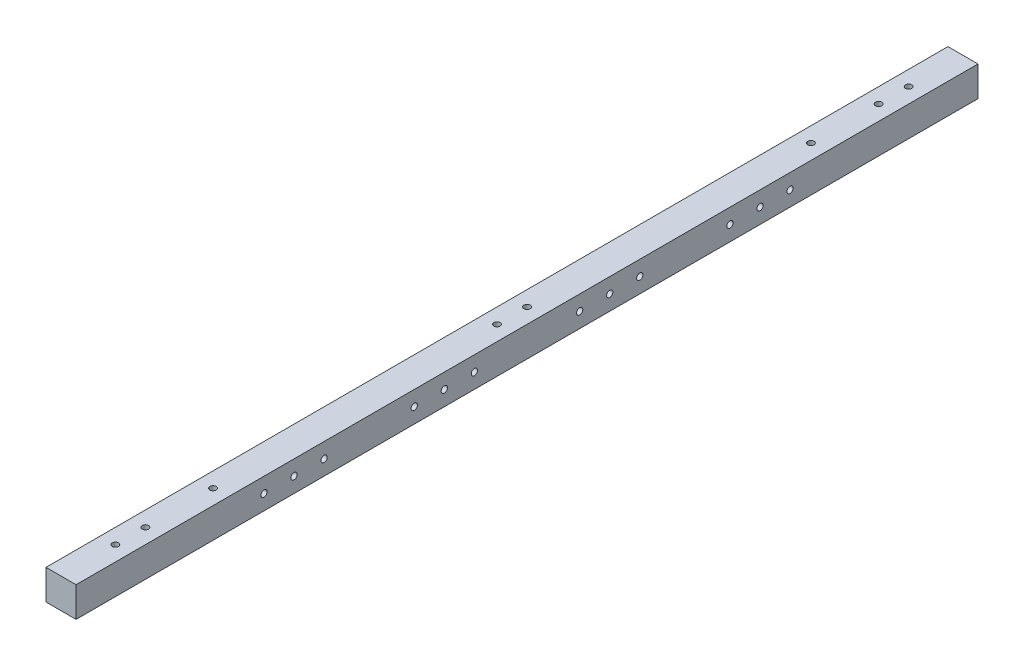
ISO-10303-21;
HEADER;
FILE_DESCRIPTION(('STEP AP214'),'2;1');
FILE_NAME('part.step','',(''),(''),'','','');
FILE_SCHEMA(('AUTOMOTIVE_DESIGN { 1 0 10303 214 1 1 1 1 }'));
ENDSEC;
DATA;
#1=APPLICATION_CONTEXT('core data for automotive mechanical design processes');
#2=APPLICATION_PROTOCOL_DEFINITION('international standard','automotive_design',2000,#1);
#3=PRODUCT_CONTEXT('',#1,'mechanical');
#4=PRODUCT('Part','Part','',(#3));
#5=PRODUCT_RELATED_PRODUCT_CATEGORY('part','',(#4));
#6=PRODUCT_DEFINITION_FORMATION('','',#4);
#7=PRODUCT_DEFINITION_CONTEXT('part definition',#1,'design');
#8=PRODUCT_DEFINITION('design','',#6,#7);
#9=PRODUCT_DEFINITION_SHAPE('','',#8);
#10=(LENGTH_UNIT() NAMED_UNIT(*) SI_UNIT(.MILLI.,.METRE.));
#11=(NAMED_UNIT(*) PLANE_ANGLE_UNIT() SI_UNIT($,.RADIAN.));
#12=(NAMED_UNIT(*) SI_UNIT($,.STERADIAN.) SOLID_ANGLE_UNIT());
#13=UNCERTAINTY_MEASURE_WITH_UNIT(LENGTH_MEASURE(1.E-05),#10,'distance_accuracy_value','');
#14=(GEOMETRIC_REPRESENTATION_CONTEXT(3) GLOBAL_UNCERTAINTY_ASSIGNED_CONTEXT((#13)) GLOBAL_UNIT_ASSIGNED_CONTEXT((#10,
#11,#12)) REPRESENTATION_CONTEXT('',''));
#15=CARTESIAN_POINT('',(0.,0.,0.));
#16=DIRECTION('',(0.,0.,1.));
#17=DIRECTION('',(1.,0.,0.));
#18=AXIS2_PLACEMENT_3D('',#15,#16,#17);
#19=CARTESIAN_POINT('',(10.,10.,600.));
#20=DIRECTION('',(-1.,0.,0.));
#21=DIRECTION('',(0.,0.,1.));
#22=AXIS2_PLACEMENT_3D('',#19,#20,#21);
#23=PLANE('',#22);
#24=CARTESIAN_POINT('',(10.,0.,165.));
#25=DIRECTION('',(-1.,0.,0.));
#26=DIRECTION('',(0.,0.,-1.));
#27=AXIS2_PLACEMENT_3D('',#24,#25,#26);
#28=CIRCLE('',#27,2.09999999999999);
#29=CARTESIAN_POINT('',(10.,0.,162.9));
#30=VERTEX_POINT('',#29);
#31=EDGE_CURVE('E195',#30,#30,#28,.T.);
#32=ORIENTED_EDGE('',*,*,#31,.T.);
#33=EDGE_LOOP('',(#32));
#34=FACE_BOUND('',#33,.T.);
#35=CARTESIAN_POINT('',(10.,0.,145.));
#36=DIRECTION('',(-1.,0.,0.));
#37=DIRECTION('',(0.,0.,-1.));
#38=AXIS2_PLACEMENT_3D('',#35,#36,#37);
#39=CIRCLE('',#38,2.09999999999999);
#40=CARTESIAN_POINT('',(10.,0.,142.9));
#41=VERTEX_POINT('',#40);
#42=EDGE_CURVE('E204',#41,#41,#39,.T.);
#43=ORIENTED_EDGE('',*,*,#42,.T.);
#44=EDGE_LOOP('',(#43));
#45=FACE_BOUND('',#44,.T.);
#46=CARTESIAN_POINT('',(10.,0.,125.));
#47=DIRECTION('',(-1.,0.,0.));
#48=DIRECTION('',(0.,0.,-1.));
#49=AXIS2_PLACEMENT_3D('',#46,#47,#48);
#50=CIRCLE('',#49,2.09999999999999);
#51=CARTESIAN_POINT('',(10.,0.,122.9));
#52=VERTEX_POINT('',#51);
#53=EDGE_CURVE('E212',#52,#52,#50,.T.);
#54=ORIENTED_EDGE('',*,*,#53,.T.);
#55=EDGE_LOOP('',(#54));
#56=FACE_BOUND('',#55,.T.);
#57=CARTESIAN_POINT('',(10.,0.,355.));
#58=DIRECTION('',(-1.,0.,0.));
#59=DIRECTION('',(0.,0.,-1.));
#60=AXIS2_PLACEMENT_3D('',#57,#58,#59);
#61=CIRCLE('',#60,2.09999999999994);
#62=CARTESIAN_POINT('',(10.,0.,352.9));
#63=VERTEX_POINT('',#62);
#64=EDGE_CURVE('E237',#63,#63,#61,.T.);
#65=ORIENTED_EDGE('',*,*,#64,.T.);
#66=EDGE_LOOP('',(#65));
#67=FACE_BOUND('',#66,.T.);
#68=CARTESIAN_POINT('',(10.,0.,265.));
#69=DIRECTION('',(-1.,0.,0.));
#70=DIRECTION('',(0.,0.,1.));
#71=AXIS2_PLACEMENT_3D('',#68,#69,#70);
#72=CIRCLE('',#71,2.09999999999999);
#73=CARTESIAN_POINT('',(10.,0.,267.1));
#74=VERTEX_POINT('',#73);
#75=EDGE_CURVE('E222',#74,#74,#72,.T.);
#76=ORIENTED_EDGE('',*,*,#75,.T.);
#77=EDGE_LOOP('',(#76));
#78=FACE_BOUND('',#77,.T.);
#79=CARTESIAN_POINT('',(10.,0.,245.));
#80=DIRECTION('',(-1.,0.,0.));
#81=DIRECTION('',(0.,0.,1.));
#82=AXIS2_PLACEMENT_3D('',#79,#80,#81);
#83=CIRCLE('',#82,2.09999999999999);
#84=CARTESIAN_POINT('',(10.,0.,247.1));
#85=VERTEX_POINT('',#84);
#86=EDGE_CURVE('E221',#85,#85,#83,.T.);
#87=ORIENTED_EDGE('',*,*,#86,.T.);
#88=EDGE_LOOP('',(#87));
#89=FACE_BOUND('',#88,.T.);
#90=CARTESIAN_POINT('',(10.,0.,375.));
#91=DIRECTION('',(-1.,0.,0.));
#92=DIRECTION('',(0.,0.,-1.));
#93=AXIS2_PLACEMENT_3D('',#90,#91,#92);
#94=CIRCLE('',#93,2.09999999999999);
#95=CARTESIAN_POINT('',(10.,0.,372.9));
#96=VERTEX_POINT('',#95);
#97=EDGE_CURVE('E187',#96,#96,#94,.T.);
#98=ORIENTED_EDGE('',*,*,#97,.T.);
#99=EDGE_LOOP('',(#98));
#100=FACE_BOUND('',#99,.T.);
#101=CARTESIAN_POINT('',(10.,0.,335.));
#102=DIRECTION('',(-1.,0.,0.));
#103=DIRECTION('',(0.,0.,-1.));
#104=AXIS2_PLACEMENT_3D('',#101,#102,#103);
#105=CIRCLE('',#104,2.09999999999999);
#106=CARTESIAN_POINT('',(10.,0.,332.9));
#107=VERTEX_POINT('',#106);
#108=EDGE_CURVE('E238',#107,#107,#105,.T.);
#109=ORIENTED_EDGE('',*,*,#108,.T.);
#110=EDGE_LOOP('',(#109));
#111=FACE_BOUND('',#110,.T.);
#112=CARTESIAN_POINT('',(10.,0.,435.));
#113=DIRECTION('',(-1.,0.,0.));
#114=DIRECTION('',(0.,0.,1.));
#115=AXIS2_PLACEMENT_3D('',#112,#113,#114);
#116=CIRCLE('',#115,2.09999999999999);
#117=CARTESIAN_POINT('',(10.,0.,437.1));
#118=VERTEX_POINT('',#117);
#119=EDGE_CURVE('E268',#118,#118,#116,.T.);
#120=ORIENTED_EDGE('',*,*,#119,.T.);
#121=EDGE_LOOP('',(#120));
#122=FACE_BOUND('',#121,.T.);
#123=CARTESIAN_POINT('',(10.,0.,455.));
#124=DIRECTION('',(-1.,0.,0.));
#125=DIRECTION('',(0.,0.,1.));
#126=AXIS2_PLACEMENT_3D('',#123,#124,#125);
#127=CIRCLE('',#126,2.09999999999999);
#128=CARTESIAN_POINT('',(10.,0.,457.1));
#129=VERTEX_POINT('',#128);
#130=EDGE_CURVE('E260',#129,#129,#127,.T.);
#131=ORIENTED_EDGE('',*,*,#130,.T.);
#132=EDGE_LOOP('',(#131));
#133=FACE_BOUND('',#132,.T.);
#134=CARTESIAN_POINT('',(10.,0.,475.));
#135=DIRECTION('',(-1.,0.,0.));
#136=DIRECTION('',(0.,0.,1.));
#137=AXIS2_PLACEMENT_3D('',#134,#135,#136);
#138=CIRCLE('',#137,2.09999999999999);
#139=CARTESIAN_POINT('',(10.,0.,477.1));
#140=VERTEX_POINT('',#139);
#141=EDGE_CURVE('E252',#140,#140,#138,.T.);
#142=ORIENTED_EDGE('',*,*,#141,.T.);
#143=EDGE_LOOP('',(#142));
#144=FACE_BOUND('',#143,.T.);
#145=CARTESIAN_POINT('',(10.,0.,225.));
#146=DIRECTION('',(-1.,0.,0.));
#147=DIRECTION('',(0.,0.,1.));
#148=AXIS2_PLACEMENT_3D('',#145,#146,#147);
#149=CIRCLE('',#148,2.09999999999999);
#150=CARTESIAN_POINT('',(10.,0.,227.1));
#151=VERTEX_POINT('',#150);
#152=EDGE_CURVE('E176',#151,#151,#149,.T.);
#153=ORIENTED_EDGE('',*,*,#152,.T.);
#154=EDGE_LOOP('',(#153));
#155=FACE_BOUND('',#154,.T.);
#156=DIRECTION('',(0.,1.,0.));
#157=VECTOR('',#156,1.);
#158=CARTESIAN_POINT('',(10.,10.,0.));
#159=LINE('',#158,#157);
#160=CARTESIAN_POINT('',(10.,-10.,0.));
#161=VERTEX_POINT('',#160);
#162=CARTESIAN_POINT('',(10.,10.,0.));
#163=VERTEX_POINT('',#162);
#164=EDGE_CURVE('E114',#161,#163,#159,.T.);
#165=ORIENTED_EDGE('',*,*,#164,.T.);
#166=DIRECTION('',(0.,0.,-1.));
#167=VECTOR('',#166,1.);
#168=CARTESIAN_POINT('',(10.,10.,600.));
#169=LINE('',#168,#167);
#170=CARTESIAN_POINT('',(10.,10.,600.));
#171=VERTEX_POINT('',#170);
#172=EDGE_CURVE('E11',#171,#163,#169,.T.);
#173=ORIENTED_EDGE('',*,*,#172,.F.);
#174=DIRECTION('',(0.,1.,0.));
#175=VECTOR('',#174,1.);
#176=CARTESIAN_POINT('',(10.,10.,600.));
#177=LINE('',#176,#175);
#178=CARTESIAN_POINT('',(10.,-10.,600.));
#179=VERTEX_POINT('',#178);
#180=EDGE_CURVE('E97',#179,#171,#177,.T.);
#181=ORIENTED_EDGE('',*,*,#180,.F.);
#182=DIRECTION('',(0.,0.,-1.));
#183=VECTOR('',#182,1.);
#184=CARTESIAN_POINT('',(10.,-10.,600.));
#185=LINE('',#184,#183);
#186=EDGE_CURVE('E110',#179,#161,#185,.T.);
#187=ORIENTED_EDGE('',*,*,#186,.T.);
#188=EDGE_LOOP('',(#165,#173,#181,#187));
#189=FACE_BOUND('',#188,.T.);
#190=ADVANCED_FACE('F43',(#34,#45,#56,#67,#78,#89,#100,#111,#122,#133,#144,#155,#189),#23,.F.);
#191=CARTESIAN_POINT('',(-10.,10.,600.));
#192=DIRECTION('',(0.,-1.,0.));
#193=DIRECTION('',(0.,0.,-1.));
#194=AXIS2_PLACEMENT_3D('',#191,#192,#193);
#195=PLANE('',#194);
#196=CARTESIAN_POINT('',(0.,10.,310.));
#197=DIRECTION('',(0.,1.,0.));
#198=DIRECTION('',(0.,0.,1.));
#199=AXIS2_PLACEMENT_3D('',#196,#197,#198);
#200=CIRCLE('',#199,2.1);
#201=CARTESIAN_POINT('',(0.,10.,312.1));
#202=VERTEX_POINT('',#201);
#203=EDGE_CURVE('E287',#202,#202,#200,.T.);
#204=ORIENTED_EDGE('',*,*,#203,.F.);
#205=EDGE_LOOP('',(#204));
#206=FACE_BOUND('',#205,.T.);
#207=CARTESIAN_POINT('',(0.,10.,290.));
#208=DIRECTION('',(0.,1.,0.));
#209=DIRECTION('',(0.,0.,-1.));
#210=AXIS2_PLACEMENT_3D('',#207,#208,#209);
#211=CIRCLE('',#210,2.1);
#212=CARTESIAN_POINT('',(0.,10.,287.9));
#213=VERTEX_POINT('',#212);
#214=EDGE_CURVE('E279',#213,#213,#211,.T.);
#215=ORIENTED_EDGE('',*,*,#214,.F.);
#216=EDGE_LOOP('',(#215));
#217=FACE_BOUND('',#216,.T.);
#218=CARTESIAN_POINT('',(0.,10.,563.88));
#219=DIRECTION('',(0.,-1.,0.));
#220=DIRECTION('',(0.,0.,-1.));
#221=AXIS2_PLACEMENT_3D('',#218,#219,#220);
#222=CIRCLE('',#221,2.1);
#223=CARTESIAN_POINT('',(0.,10.,561.78));
#224=VERTEX_POINT('',#223);
#225=EDGE_CURVE('E145',#224,#224,#222,.T.);
#226=ORIENTED_EDGE('',*,*,#225,.T.);
#227=EDGE_LOOP('',(#226));
#228=FACE_BOUND('',#227,.T.);
#229=CARTESIAN_POINT('',(0.,10.,543.88));
#230=DIRECTION('',(0.,-1.,0.));
#231=DIRECTION('',(0.,0.,-1.));
#232=AXIS2_PLACEMENT_3D('',#229,#230,#231);
#233=CIRCLE('',#232,2.1);
#234=CARTESIAN_POINT('',(0.,10.,541.78));
#235=VERTEX_POINT('',#234);
#236=EDGE_CURVE('E175',#235,#235,#233,.T.);
#237=ORIENTED_EDGE('',*,*,#236,.T.);
#238=EDGE_LOOP('',(#237));
#239=FACE_BOUND('',#238,.T.);
#240=CARTESIAN_POINT('',(0.,10.,498.88));
#241=DIRECTION('',(0.,-1.,0.));
#242=DIRECTION('',(0.,0.,-1.));
#243=AXIS2_PLACEMENT_3D('',#240,#241,#242);
#244=CIRCLE('',#243,2.1);
#245=CARTESIAN_POINT('',(0.,10.,496.78));
#246=VERTEX_POINT('',#245);
#247=EDGE_CURVE('E171',#246,#246,#244,.T.);
#248=ORIENTED_EDGE('',*,*,#247,.T.);
#249=EDGE_LOOP('',(#248));
#250=FACE_BOUND('',#249,.T.);
#251=CARTESIAN_POINT('',(0.,10.,36.12));
#252=DIRECTION('',(0.,1.,0.));
#253=DIRECTION('',(0.,0.,1.));
#254=AXIS2_PLACEMENT_3D('',#251,#252,#253);
#255=CIRCLE('',#254,2.1);
#256=CARTESIAN_POINT('',(0.,10.,38.22));
#257=VERTEX_POINT('',#256);
#258=EDGE_CURVE('E134',#257,#257,#255,.T.);
#259=ORIENTED_EDGE('',*,*,#258,.F.);
#260=EDGE_LOOP('',(#259));
#261=FACE_BOUND('',#260,.T.);
#262=CARTESIAN_POINT('',(0.,10.,56.12));
#263=DIRECTION('',(0.,1.,0.));
#264=DIRECTION('',(0.,0.,1.));
#265=AXIS2_PLACEMENT_3D('',#262,#263,#264);
#266=CIRCLE('',#265,2.1);
#267=CARTESIAN_POINT('',(0.,10.,58.22));
#268=VERTEX_POINT('',#267);
#269=EDGE_CURVE('E157',#268,#268,#266,.T.);
#270=ORIENTED_EDGE('',*,*,#269,.F.);
#271=EDGE_LOOP('',(#270));
#272=FACE_BOUND('',#271,.T.);
#273=CARTESIAN_POINT('',(0.,10.,101.12));
#274=DIRECTION('',(0.,1.,0.));
#275=DIRECTION('',(0.,0.,1.));
#276=AXIS2_PLACEMENT_3D('',#273,#274,#275);
#277=CIRCLE('',#276,2.1);
#278=CARTESIAN_POINT('',(0.,10.,103.22));
#279=VERTEX_POINT('',#278);
#280=EDGE_CURVE('E152',#279,#279,#277,.T.);
#281=ORIENTED_EDGE('',*,*,#280,.F.);
#282=EDGE_LOOP('',(#281));
#283=FACE_BOUND('',#282,.T.);
#284=DIRECTION('',(-1.,0.,0.));
#285=VECTOR('',#284,1.);
#286=CARTESIAN_POINT('',(-10.,10.,0.));
#287=LINE('',#286,#285);
#288=CARTESIAN_POINT('',(-10.,10.,0.));
#289=VERTEX_POINT('',#288);
#290=EDGE_CURVE('E102',#163,#289,#287,.T.);
#291=ORIENTED_EDGE('',*,*,#290,.T.);
#292=DIRECTION('',(0.,0.,-1.));
#293=VECTOR('',#292,1.);
#294=CARTESIAN_POINT('',(-10.,10.,600.));
#295=LINE('',#294,#293);
#296=CARTESIAN_POINT('',(-10.,10.,600.));
#297=VERTEX_POINT('',#296);
#298=EDGE_CURVE('E53',#297,#289,#295,.T.);
#299=ORIENTED_EDGE('',*,*,#298,.F.);
#300=DIRECTION('',(-1.,0.,0.));
#301=VECTOR('',#300,1.);
#302=CARTESIAN_POINT('',(-10.,10.,600.));
#303=LINE('',#302,#301);
#304=EDGE_CURVE('E92',#171,#297,#303,.T.);
#305=ORIENTED_EDGE('',*,*,#304,.F.);
#306=ORIENTED_EDGE('',*,*,#172,.T.);
#307=EDGE_LOOP('',(#291,#299,#305,#306));
#308=FACE_BOUND('',#307,.T.);
#309=ADVANCED_FACE('F101',(#206,#217,#228,#239,#250,#261,#272,#283,#308),#195,.F.);
#310=CARTESIAN_POINT('',(-10.,10.,600.));
#311=DIRECTION('',(1.,0.,0.));
#312=DIRECTION('',(0.,0.,-1.));
#313=AXIS2_PLACEMENT_3D('',#310,#311,#312);
#314=PLANE('',#313);
#315=CARTESIAN_POINT('',(-10.,0.,165.));
#316=DIRECTION('',(-1.,0.,0.));
#317=DIRECTION('',(0.,0.,-1.));
#318=AXIS2_PLACEMENT_3D('',#315,#316,#317);
#319=CIRCLE('',#318,2.09999999999999);
#320=CARTESIAN_POINT('',(-10.,0.,162.9));
#321=VERTEX_POINT('',#320);
#322=EDGE_CURVE('E191',#321,#321,#319,.T.);
#323=ORIENTED_EDGE('',*,*,#322,.F.);
#324=EDGE_LOOP('',(#323));
#325=FACE_BOUND('',#324,.T.);
#326=CARTESIAN_POINT('',(-10.,0.,145.));
#327=DIRECTION('',(-1.,0.,0.));
#328=DIRECTION('',(0.,0.,-1.));
#329=AXIS2_PLACEMENT_3D('',#326,#327,#328);
#330=CIRCLE('',#329,2.09999999999999);
#331=CARTESIAN_POINT('',(-10.,0.,142.9));
#332=VERTEX_POINT('',#331);
#333=EDGE_CURVE('E200',#332,#332,#330,.T.);
#334=ORIENTED_EDGE('',*,*,#333,.F.);
#335=EDGE_LOOP('',(#334));
#336=FACE_BOUND('',#335,.T.);
#337=CARTESIAN_POINT('',(-10.,0.,125.));
#338=DIRECTION('',(-1.,0.,0.));
#339=DIRECTION('',(0.,0.,-1.));
#340=AXIS2_PLACEMENT_3D('',#337,#338,#339);
#341=CIRCLE('',#340,2.09999999999999);
#342=CARTESIAN_POINT('',(-10.,0.,122.9));
#343=VERTEX_POINT('',#342);
#344=EDGE_CURVE('E208',#343,#343,#341,.T.);
#345=ORIENTED_EDGE('',*,*,#344,.F.);
#346=EDGE_LOOP('',(#345));
#347=FACE_BOUND('',#346,.T.);
#348=CARTESIAN_POINT('',(-10.,0.,355.));
#349=DIRECTION('',(-1.,0.,0.));
#350=DIRECTION('',(0.,0.,-1.));
#351=AXIS2_PLACEMENT_3D('',#348,#349,#350);
#352=CIRCLE('',#351,2.09999999999994);
#353=CARTESIAN_POINT('',(-10.,0.,352.9));
#354=VERTEX_POINT('',#353);
#355=EDGE_CURVE('E233',#354,#354,#352,.T.);
#356=ORIENTED_EDGE('',*,*,#355,.F.);
#357=EDGE_LOOP('',(#356));
#358=FACE_BOUND('',#357,.T.);
#359=CARTESIAN_POINT('',(-10.,0.,265.));
#360=DIRECTION('',(-1.,0.,0.));
#361=DIRECTION('',(0.,0.,1.));
#362=AXIS2_PLACEMENT_3D('',#359,#360,#361);
#363=CIRCLE('',#362,2.09999999999999);
#364=CARTESIAN_POINT('',(-10.,0.,267.1));
#365=VERTEX_POINT('',#364);
#366=EDGE_CURVE('E242',#365,#365,#363,.T.);
#367=ORIENTED_EDGE('',*,*,#366,.F.);
#368=EDGE_LOOP('',(#367));
#369=FACE_BOUND('',#368,.T.);
#370=CARTESIAN_POINT('',(-10.,0.,245.));
#371=DIRECTION('',(-1.,0.,0.));
#372=DIRECTION('',(0.,0.,1.));
#373=AXIS2_PLACEMENT_3D('',#370,#371,#372);
#374=CIRCLE('',#373,2.09999999999999);
#375=CARTESIAN_POINT('',(-10.,0.,247.1));
#376=VERTEX_POINT('',#375);
#377=EDGE_CURVE('E217',#376,#376,#374,.T.);
#378=ORIENTED_EDGE('',*,*,#377,.F.);
#379=EDGE_LOOP('',(#378));
#380=FACE_BOUND('',#379,.T.);
#381=CARTESIAN_POINT('',(-10.,0.,375.));
#382=DIRECTION('',(-1.,0.,0.));
#383=DIRECTION('',(0.,0.,-1.));
#384=AXIS2_PLACEMENT_3D('',#381,#382,#383);
#385=CIRCLE('',#384,2.09999999999999);
#386=CARTESIAN_POINT('',(-10.,0.,372.9));
#387=VERTEX_POINT('',#386);
#388=EDGE_CURVE('E226',#387,#387,#385,.T.);
#389=ORIENTED_EDGE('',*,*,#388,.F.);
#390=EDGE_LOOP('',(#389));
#391=FACE_BOUND('',#390,.T.);
#392=CARTESIAN_POINT('',(-10.,0.,335.));
#393=DIRECTION('',(-1.,0.,0.));
#394=DIRECTION('',(0.,0.,-1.));
#395=AXIS2_PLACEMENT_3D('',#392,#393,#394);
#396=CIRCLE('',#395,2.09999999999999);
#397=CARTESIAN_POINT('',(-10.,0.,332.9));
#398=VERTEX_POINT('',#397);
#399=EDGE_CURVE('E272',#398,#398,#396,.T.);
#400=ORIENTED_EDGE('',*,*,#399,.F.);
#401=EDGE_LOOP('',(#400));
#402=FACE_BOUND('',#401,.T.);
#403=CARTESIAN_POINT('',(-10.,0.,435.));
#404=DIRECTION('',(-1.,0.,0.));
#405=DIRECTION('',(0.,0.,1.));
#406=AXIS2_PLACEMENT_3D('',#403,#404,#405);
#407=CIRCLE('',#406,2.09999999999999);
#408=CARTESIAN_POINT('',(-10.,0.,437.1));
#409=VERTEX_POINT('',#408);
#410=EDGE_CURVE('E264',#409,#409,#407,.T.);
#411=ORIENTED_EDGE('',*,*,#410,.F.);
#412=EDGE_LOOP('',(#411));
#413=FACE_BOUND('',#412,.T.);
#414=CARTESIAN_POINT('',(-10.,0.,455.));
#415=DIRECTION('',(-1.,0.,0.));
#416=DIRECTION('',(0.,0.,1.));
#417=AXIS2_PLACEMENT_3D('',#414,#415,#416);
#418=CIRCLE('',#417,2.09999999999999);
#419=CARTESIAN_POINT('',(-10.,0.,457.1));
#420=VERTEX_POINT('',#419);
#421=EDGE_CURVE('E256',#420,#420,#418,.T.);
#422=ORIENTED_EDGE('',*,*,#421,.F.);
#423=EDGE_LOOP('',(#422));
#424=FACE_BOUND('',#423,.T.);
#425=CARTESIAN_POINT('',(-10.,0.,475.));
#426=DIRECTION('',(-1.,0.,0.));
#427=DIRECTION('',(0.,0.,1.));
#428=AXIS2_PLACEMENT_3D('',#425,#426,#427);
#429=CIRCLE('',#428,2.09999999999999);
#430=CARTESIAN_POINT('',(-10.,0.,477.1));
#431=VERTEX_POINT('',#430);
#432=EDGE_CURVE('E216',#431,#431,#429,.T.);
#433=ORIENTED_EDGE('',*,*,#432,.F.);
#434=EDGE_LOOP('',(#433));
#435=FACE_BOUND('',#434,.T.);
#436=CARTESIAN_POINT('',(-10.,0.,225.));
#437=DIRECTION('',(-1.,0.,0.));
#438=DIRECTION('',(0.,0.,1.));
#439=AXIS2_PLACEMENT_3D('',#436,#437,#438);
#440=CIRCLE('',#439,2.09999999999999);
#441=CARTESIAN_POINT('',(-10.,0.,227.1));
#442=VERTEX_POINT('',#441);
#443=EDGE_CURVE('E183',#442,#442,#440,.T.);
#444=ORIENTED_EDGE('',*,*,#443,.F.);
#445=EDGE_LOOP('',(#444));
#446=FACE_BOUND('',#445,.T.);
#447=DIRECTION('',(0.,-1.,0.));
#448=VECTOR('',#447,1.);
#449=CARTESIAN_POINT('',(-10.,10.,0.));
#450=LINE('',#449,#448);
#451=CARTESIAN_POINT('',(-10.,-10.,0.));
#452=VERTEX_POINT('',#451);
#453=EDGE_CURVE('E79',#289,#452,#450,.T.);
#454=ORIENTED_EDGE('',*,*,#453,.T.);
#455=DIRECTION('',(0.,0.,-1.));
#456=VECTOR('',#455,1.);
#457=CARTESIAN_POINT('',(-10.,-10.,600.));
#458=LINE('',#457,#456);
#459=CARTESIAN_POINT('',(-10.,-10.,600.));
#460=VERTEX_POINT('',#459);
#461=EDGE_CURVE('E104',#460,#452,#458,.T.);
#462=ORIENTED_EDGE('',*,*,#461,.F.);
#463=DIRECTION('',(0.,-1.,0.));
#464=VECTOR('',#463,1.);
#465=CARTESIAN_POINT('',(-10.,10.,600.));
#466=LINE('',#465,#464);
#467=EDGE_CURVE('E95',#297,#460,#466,.T.);
#468=ORIENTED_EDGE('',*,*,#467,.F.);
#469=ORIENTED_EDGE('',*,*,#298,.T.);
#470=EDGE_LOOP('',(#454,#462,#468,#469));
#471=FACE_BOUND('',#470,.T.);
#472=ADVANCED_FACE('F106',(#325,#336,#347,#358,#369,#380,#391,#402,#413,#424,#435,#446,#471),
#314,.F.);
#473=CARTESIAN_POINT('',(-10.,-10.,600.));
#474=DIRECTION('',(0.,1.,0.));
#475=DIRECTION('',(0.,0.,1.));
#476=AXIS2_PLACEMENT_3D('',#473,#474,#475);
#477=PLANE('',#476);
#478=CARTESIAN_POINT('',(0.,-10.,310.));
#479=DIRECTION('',(0.,1.,0.));
#480=DIRECTION('',(0.,0.,1.));
#481=AXIS2_PLACEMENT_3D('',#478,#479,#480);
#482=CIRCLE('',#481,2.1);
#483=CARTESIAN_POINT('',(0.,-10.,312.1));
#484=VERTEX_POINT('',#483);
#485=EDGE_CURVE('E196',#484,#484,#482,.T.);
#486=ORIENTED_EDGE('',*,*,#485,.T.);
#487=EDGE_LOOP('',(#486));
#488=FACE_BOUND('',#487,.T.);
#489=CARTESIAN_POINT('',(0.,-10.,290.));
#490=DIRECTION('',(0.,1.,0.));
#491=DIRECTION('',(0.,0.,-1.));
#492=AXIS2_PLACEMENT_3D('',#489,#490,#491);
#493=CIRCLE('',#492,2.1);
#494=CARTESIAN_POINT('',(0.,-10.,287.9));
#495=VERTEX_POINT('',#494);
#496=EDGE_CURVE('E283',#495,#495,#493,.T.);
#497=ORIENTED_EDGE('',*,*,#496,.T.);
#498=EDGE_LOOP('',(#497));
#499=FACE_BOUND('',#498,.T.);
#500=CARTESIAN_POINT('',(0.,-10.,563.88));
#501=DIRECTION('',(0.,1.,0.));
#502=DIRECTION('',(0.,0.,1.));
#503=AXIS2_PLACEMENT_3D('',#500,#501,#502);
#504=CIRCLE('',#503,2.1);
#505=CARTESIAN_POINT('',(0.,-10.,565.98));
#506=VERTEX_POINT('',#505);
#507=EDGE_CURVE('E46',#506,#506,#504,.F.);
#508=ORIENTED_EDGE('',*,*,#507,.F.);
#509=EDGE_LOOP('',(#508));
#510=FACE_BOUND('',#509,.T.);
#511=CARTESIAN_POINT('',(0.,-10.,543.88));
#512=DIRECTION('',(0.,1.,0.));
#513=DIRECTION('',(0.,0.,1.));
#514=AXIS2_PLACEMENT_3D('',#511,#512,#513);
#515=CIRCLE('',#514,2.1);
#516=CARTESIAN_POINT('',(0.,-10.,545.98));
#517=VERTEX_POINT('',#516);
#518=EDGE_CURVE('E144',#517,#517,#515,.F.);
#519=ORIENTED_EDGE('',*,*,#518,.F.);
#520=EDGE_LOOP('',(#519));
#521=FACE_BOUND('',#520,.T.);
#522=CARTESIAN_POINT('',(0.,-10.,498.88));
#523=DIRECTION('',(0.,1.,0.));
#524=DIRECTION('',(0.,0.,1.));
#525=AXIS2_PLACEMENT_3D('',#522,#523,#524);
#526=CIRCLE('',#525,2.1);
#527=CARTESIAN_POINT('',(0.,-10.,500.98));
#528=VERTEX_POINT('',#527);
#529=EDGE_CURVE('E141',#528,#528,#526,.F.);
#530=ORIENTED_EDGE('',*,*,#529,.F.);
#531=EDGE_LOOP('',(#530));
#532=FACE_BOUND('',#531,.T.);
#533=CARTESIAN_POINT('',(0.,-10.,36.12));
#534=DIRECTION('',(0.,1.,0.));
#535=DIRECTION('',(0.,0.,1.));
#536=AXIS2_PLACEMENT_3D('',#533,#534,#535);
#537=CIRCLE('',#536,2.1);
#538=CARTESIAN_POINT('',(0.,-10.,38.22));
#539=VERTEX_POINT('',#538);
#540=EDGE_CURVE('E118',#539,#539,#537,.T.);
#541=ORIENTED_EDGE('',*,*,#540,.T.);
#542=EDGE_LOOP('',(#541));
#543=FACE_BOUND('',#542,.T.);
#544=CARTESIAN_POINT('',(0.,-10.,56.12));
#545=DIRECTION('',(0.,1.,0.));
#546=DIRECTION('',(0.,0.,1.));
#547=AXIS2_PLACEMENT_3D('',#544,#545,#546);
#548=CIRCLE('',#547,2.1);
#549=CARTESIAN_POINT('',(0.,-10.,58.22));
#550=VERTEX_POINT('',#549);
#551=EDGE_CURVE('E133',#550,#550,#548,.T.);
#552=ORIENTED_EDGE('',*,*,#551,.T.);
#553=EDGE_LOOP('',(#552));
#554=FACE_BOUND('',#553,.T.);
#555=CARTESIAN_POINT('',(0.,-10.,101.12));
#556=DIRECTION('',(0.,1.,0.));
#557=DIRECTION('',(0.,0.,1.));
#558=AXIS2_PLACEMENT_3D('',#555,#556,#557);
#559=CIRCLE('',#558,2.1);
#560=CARTESIAN_POINT('',(0.,-10.,103.22));
#561=VERTEX_POINT('',#560);
#562=EDGE_CURVE('E129',#561,#561,#559,.T.);
#563=ORIENTED_EDGE('',*,*,#562,.T.);
#564=EDGE_LOOP('',(#563));
#565=FACE_BOUND('',#564,.T.);
#566=DIRECTION('',(1.,0.,0.));
#567=VECTOR('',#566,1.);
#568=CARTESIAN_POINT('',(-10.,-10.,0.));
#569=LINE('',#568,#567);
#570=EDGE_CURVE('E85',#452,#161,#569,.T.);
#571=ORIENTED_EDGE('',*,*,#570,.T.);
#572=ORIENTED_EDGE('',*,*,#186,.F.);
#573=DIRECTION('',(1.,0.,0.));
#574=VECTOR('',#573,1.);
#575=CARTESIAN_POINT('',(-10.,-10.,600.));
#576=LINE('',#575,#574);
#577=EDGE_CURVE('E62',#460,#179,#576,.T.);
#578=ORIENTED_EDGE('',*,*,#577,.F.);
#579=ORIENTED_EDGE('',*,*,#461,.T.);
#580=EDGE_LOOP('',(#571,#572,#578,#579));
#581=FACE_BOUND('',#580,.T.);
#582=ADVANCED_FACE('F295',(#488,#499,#510,#521,#532,#543,#554,#565,#581),#477,.F.);
#583=CARTESIAN_POINT('',(0.,0.,600.));
#584=DIRECTION('',(0.,0.,1.));
#585=DIRECTION('',(1.,0.,0.));
#586=AXIS2_PLACEMENT_3D('',#583,#584,#585);
#587=PLANE('',#586);
#588=ORIENTED_EDGE('',*,*,#180,.T.);
#589=ORIENTED_EDGE('',*,*,#304,.T.);
#590=ORIENTED_EDGE('',*,*,#467,.T.);
#591=ORIENTED_EDGE('',*,*,#577,.T.);
#592=EDGE_LOOP('',(#588,#589,#590,#591));
#593=FACE_BOUND('',#592,.T.);
#594=ADVANCED_FACE('F93',(#593),#587,.T.);
#595=CARTESIAN_POINT('',(0.,0.,0.));
#596=DIRECTION('',(0.,0.,1.));
#597=DIRECTION('',(1.,0.,0.));
#598=AXIS2_PLACEMENT_3D('',#595,#596,#597);
#599=PLANE('',#598);
#600=ORIENTED_EDGE('',*,*,#164,.F.);
#601=ORIENTED_EDGE('',*,*,#570,.F.);
#602=ORIENTED_EDGE('',*,*,#453,.F.);
#603=ORIENTED_EDGE('',*,*,#290,.F.);
#604=EDGE_LOOP('',(#600,#601,#602,#603));
#605=FACE_BOUND('',#604,.T.);
#606=ADVANCED_FACE('F333',(#605),#599,.F.);
#607=CARTESIAN_POINT('',(0.,-20.,101.12));
#608=DIRECTION('',(0.,1.,0.));
#609=DIRECTION('',(0.,0.,1.));
#610=AXIS2_PLACEMENT_3D('',#607,#608,#609);
#611=CYLINDRICAL_SURFACE('',#610,2.1);
#612=ORIENTED_EDGE('',*,*,#280,.T.);
#613=EDGE_LOOP('',(#612));
#614=FACE_BOUND('',#613,.T.);
#615=ORIENTED_EDGE('',*,*,#562,.F.);
#616=EDGE_LOOP('',(#615));
#617=FACE_BOUND('',#616,.T.);
#618=ADVANCED_FACE('F323',(#614,#617),#611,.F.);
#619=CARTESIAN_POINT('',(0.,-20.,56.12));
#620=DIRECTION('',(0.,1.,0.));
#621=DIRECTION('',(0.,0.,1.));
#622=AXIS2_PLACEMENT_3D('',#619,#620,#621);
#623=CYLINDRICAL_SURFACE('',#622,2.1);
#624=ORIENTED_EDGE('',*,*,#269,.T.);
#625=EDGE_LOOP('',(#624));
#626=FACE_BOUND('',#625,.T.);
#627=ORIENTED_EDGE('',*,*,#551,.F.);
#628=EDGE_LOOP('',(#627));
#629=FACE_BOUND('',#628,.T.);
#630=ADVANCED_FACE('F319',(#626,#629),#623,.F.);
#631=CARTESIAN_POINT('',(0.,-20.,36.12));
#632=DIRECTION('',(0.,1.,0.));
#633=DIRECTION('',(0.,0.,1.));
#634=AXIS2_PLACEMENT_3D('',#631,#632,#633);
#635=CYLINDRICAL_SURFACE('',#634,2.1);
#636=ORIENTED_EDGE('',*,*,#258,.T.);
#637=EDGE_LOOP('',(#636));
#638=FACE_BOUND('',#637,.T.);
#639=ORIENTED_EDGE('',*,*,#540,.F.);
#640=EDGE_LOOP('',(#639));
#641=FACE_BOUND('',#640,.T.);
#642=ADVANCED_FACE('F322',(#638,#641),#635,.F.);
#643=CARTESIAN_POINT('',(0.,-20.,498.88));
#644=DIRECTION('',(0.,1.,0.));
#645=DIRECTION('',(0.,0.,1.));
#646=AXIS2_PLACEMENT_3D('',#643,#644,#645);
#647=CYLINDRICAL_SURFACE('',#646,2.1);
#648=ORIENTED_EDGE('',*,*,#247,.F.);
#649=EDGE_LOOP('',(#648));
#650=FACE_BOUND('',#649,.T.);
#651=ORIENTED_EDGE('',*,*,#529,.T.);
#652=EDGE_LOOP('',(#651));
#653=FACE_BOUND('',#652,.T.);
#654=ADVANCED_FACE('F417',(#650,#653),#647,.F.);
#655=CARTESIAN_POINT('',(0.,-20.,543.88));
#656=DIRECTION('',(0.,1.,0.));
#657=DIRECTION('',(0.,0.,1.));
#658=AXIS2_PLACEMENT_3D('',#655,#656,#657);
#659=CYLINDRICAL_SURFACE('',#658,2.1);
#660=ORIENTED_EDGE('',*,*,#236,.F.);
#661=EDGE_LOOP('',(#660));
#662=FACE_BOUND('',#661,.T.);
#663=ORIENTED_EDGE('',*,*,#518,.T.);
#664=EDGE_LOOP('',(#663));
#665=FACE_BOUND('',#664,.T.);
#666=ADVANCED_FACE('F426',(#662,#665),#659,.F.);
#667=CARTESIAN_POINT('',(0.,-20.,563.88));
#668=DIRECTION('',(0.,1.,0.));
#669=DIRECTION('',(0.,0.,1.));
#670=AXIS2_PLACEMENT_3D('',#667,#668,#669);
#671=CYLINDRICAL_SURFACE('',#670,2.1);
#672=ORIENTED_EDGE('',*,*,#225,.F.);
#673=EDGE_LOOP('',(#672));
#674=FACE_BOUND('',#673,.T.);
#675=ORIENTED_EDGE('',*,*,#507,.T.);
#676=EDGE_LOOP('',(#675));
#677=FACE_BOUND('',#676,.T.);
#678=ADVANCED_FACE('F377',(#674,#677),#671,.F.);
#679=CARTESIAN_POINT('',(10.,0.,225.));
#680=DIRECTION('',(-1.,0.,0.));
#681=DIRECTION('',(0.,0.,1.));
#682=AXIS2_PLACEMENT_3D('',#679,#680,#681);
#683=CYLINDRICAL_SURFACE('',#682,2.09999999999999);
#684=ORIENTED_EDGE('',*,*,#152,.F.);
#685=EDGE_LOOP('',(#684));
#686=FACE_BOUND('',#685,.T.);
#687=ORIENTED_EDGE('',*,*,#443,.T.);
#688=EDGE_LOOP('',(#687));
#689=FACE_BOUND('',#688,.T.);
#690=ADVANCED_FACE('F373',(#686,#689),#683,.F.);
#691=CARTESIAN_POINT('',(10.,0.,475.));
#692=DIRECTION('',(-1.,0.,0.));
#693=DIRECTION('',(0.,0.,1.));
#694=AXIS2_PLACEMENT_3D('',#691,#692,#693);
#695=CYLINDRICAL_SURFACE('',#694,2.09999999999999);
#696=ORIENTED_EDGE('',*,*,#141,.F.);
#697=EDGE_LOOP('',(#696));
#698=FACE_BOUND('',#697,.T.);
#699=ORIENTED_EDGE('',*,*,#432,.T.);
#700=EDGE_LOOP('',(#699));
#701=FACE_BOUND('',#700,.T.);
#702=ADVANCED_FACE('F376',(#698,#701),#695,.F.);
#703=CARTESIAN_POINT('',(10.,0.,455.));
#704=DIRECTION('',(-1.,0.,0.));
#705=DIRECTION('',(0.,0.,1.));
#706=AXIS2_PLACEMENT_3D('',#703,#704,#705);
#707=CYLINDRICAL_SURFACE('',#706,2.09999999999999);
#708=ORIENTED_EDGE('',*,*,#130,.F.);
#709=EDGE_LOOP('',(#708));
#710=FACE_BOUND('',#709,.T.);
#711=ORIENTED_EDGE('',*,*,#421,.T.);
#712=EDGE_LOOP('',(#711));
#713=FACE_BOUND('',#712,.T.);
#714=ADVANCED_FACE('F455',(#710,#713),#707,.F.);
#715=CARTESIAN_POINT('',(10.,0.,435.));
#716=DIRECTION('',(-1.,0.,0.));
#717=DIRECTION('',(0.,0.,1.));
#718=AXIS2_PLACEMENT_3D('',#715,#716,#717);
#719=CYLINDRICAL_SURFACE('',#718,2.09999999999999);
#720=ORIENTED_EDGE('',*,*,#119,.F.);
#721=EDGE_LOOP('',(#720));
#722=FACE_BOUND('',#721,.T.);
#723=ORIENTED_EDGE('',*,*,#410,.T.);
#724=EDGE_LOOP('',(#723));
#725=FACE_BOUND('',#724,.T.);
#726=ADVANCED_FACE('F463',(#722,#725),#719,.F.);
#727=CARTESIAN_POINT('',(10.,0.,335.));
#728=DIRECTION('',(-1.,0.,0.));
#729=DIRECTION('',(0.,0.,1.));
#730=AXIS2_PLACEMENT_3D('',#727,#728,#729);
#731=CYLINDRICAL_SURFACE('',#730,2.09999999999999);
#732=ORIENTED_EDGE('',*,*,#108,.F.);
#733=EDGE_LOOP('',(#732));
#734=FACE_BOUND('',#733,.T.);
#735=ORIENTED_EDGE('',*,*,#399,.T.);
#736=EDGE_LOOP('',(#735));
#737=FACE_BOUND('',#736,.T.);
#738=ADVANCED_FACE('F471',(#734,#737),#731,.F.);
#739=CARTESIAN_POINT('',(10.,0.,375.));
#740=DIRECTION('',(-1.,0.,0.));
#741=DIRECTION('',(0.,0.,1.));
#742=AXIS2_PLACEMENT_3D('',#739,#740,#741);
#743=CYLINDRICAL_SURFACE('',#742,2.09999999999999);
#744=ORIENTED_EDGE('',*,*,#97,.F.);
#745=EDGE_LOOP('',(#744));
#746=FACE_BOUND('',#745,.T.);
#747=ORIENTED_EDGE('',*,*,#388,.T.);
#748=EDGE_LOOP('',(#747));
#749=FACE_BOUND('',#748,.T.);
#750=ADVANCED_FACE('F479',(#746,#749),#743,.F.);
#751=CARTESIAN_POINT('',(10.,0.,245.));
#752=DIRECTION('',(-1.,0.,0.));
#753=DIRECTION('',(0.,0.,1.));
#754=AXIS2_PLACEMENT_3D('',#751,#752,#753);
#755=CYLINDRICAL_SURFACE('',#754,2.09999999999999);
#756=ORIENTED_EDGE('',*,*,#86,.F.);
#757=EDGE_LOOP('',(#756));
#758=FACE_BOUND('',#757,.T.);
#759=ORIENTED_EDGE('',*,*,#377,.T.);
#760=EDGE_LOOP('',(#759));
#761=FACE_BOUND('',#760,.T.);
#762=ADVANCED_FACE('F487',(#758,#761),#755,.F.);
#763=CARTESIAN_POINT('',(10.,0.,265.));
#764=DIRECTION('',(-1.,0.,0.));
#765=DIRECTION('',(0.,0.,1.));
#766=AXIS2_PLACEMENT_3D('',#763,#764,#765);
#767=CYLINDRICAL_SURFACE('',#766,2.09999999999999);
#768=ORIENTED_EDGE('',*,*,#75,.F.);
#769=EDGE_LOOP('',(#768));
#770=FACE_BOUND('',#769,.T.);
#771=ORIENTED_EDGE('',*,*,#366,.T.);
#772=EDGE_LOOP('',(#771));
#773=FACE_BOUND('',#772,.T.);
#774=ADVANCED_FACE('F495',(#770,#773),#767,.F.);
#775=CARTESIAN_POINT('',(10.,0.,355.));
#776=DIRECTION('',(-1.,0.,0.));
#777=DIRECTION('',(0.,0.,1.));
#778=AXIS2_PLACEMENT_3D('',#775,#776,#777);
#779=CYLINDRICAL_SURFACE('',#778,2.09999999999994);
#780=ORIENTED_EDGE('',*,*,#64,.F.);
#781=EDGE_LOOP('',(#780));
#782=FACE_BOUND('',#781,.T.);
#783=ORIENTED_EDGE('',*,*,#355,.T.);
#784=EDGE_LOOP('',(#783));
#785=FACE_BOUND('',#784,.T.);
#786=ADVANCED_FACE('F503',(#782,#785),#779,.F.);
#787=CARTESIAN_POINT('',(10.,0.,125.));
#788=DIRECTION('',(-1.,0.,0.));
#789=DIRECTION('',(0.,0.,1.));
#790=AXIS2_PLACEMENT_3D('',#787,#788,#789);
#791=CYLINDRICAL_SURFACE('',#790,2.09999999999999);
#792=ORIENTED_EDGE('',*,*,#53,.F.);
#793=EDGE_LOOP('',(#792));
#794=FACE_BOUND('',#793,.T.);
#795=ORIENTED_EDGE('',*,*,#344,.T.);
#796=EDGE_LOOP('',(#795));
#797=FACE_BOUND('',#796,.T.);
#798=ADVANCED_FACE('F511',(#794,#797),#791,.F.);
#799=CARTESIAN_POINT('',(10.,0.,145.));
#800=DIRECTION('',(-1.,0.,0.));
#801=DIRECTION('',(0.,0.,1.));
#802=AXIS2_PLACEMENT_3D('',#799,#800,#801);
#803=CYLINDRICAL_SURFACE('',#802,2.09999999999999);
#804=ORIENTED_EDGE('',*,*,#42,.F.);
#805=EDGE_LOOP('',(#804));
#806=FACE_BOUND('',#805,.T.);
#807=ORIENTED_EDGE('',*,*,#333,.T.);
#808=EDGE_LOOP('',(#807));
#809=FACE_BOUND('',#808,.T.);
#810=ADVANCED_FACE('F519',(#806,#809),#803,.F.);
#811=CARTESIAN_POINT('',(10.,0.,165.));
#812=DIRECTION('',(-1.,0.,0.));
#813=DIRECTION('',(0.,0.,1.));
#814=AXIS2_PLACEMENT_3D('',#811,#812,#813);
#815=CYLINDRICAL_SURFACE('',#814,2.09999999999999);
#816=ORIENTED_EDGE('',*,*,#31,.F.);
#817=EDGE_LOOP('',(#816));
#818=FACE_BOUND('',#817,.T.);
#819=ORIENTED_EDGE('',*,*,#322,.T.);
#820=EDGE_LOOP('',(#819));
#821=FACE_BOUND('',#820,.T.);
#822=ADVANCED_FACE('F527',(#818,#821),#815,.F.);
#823=CARTESIAN_POINT('',(0.,-10.,290.));
#824=DIRECTION('',(0.,1.,0.));
#825=DIRECTION('',(0.,0.,1.));
#826=AXIS2_PLACEMENT_3D('',#823,#824,#825);
#827=CYLINDRICAL_SURFACE('',#826,2.1);
#828=ORIENTED_EDGE('',*,*,#496,.F.);
#829=EDGE_LOOP('',(#828));
#830=FACE_BOUND('',#829,.T.);
#831=ORIENTED_EDGE('',*,*,#214,.T.);
#832=EDGE_LOOP('',(#831));
#833=FACE_BOUND('',#832,.T.);
#834=ADVANCED_FACE('F301',(#830,#833),#827,.F.);
#835=CARTESIAN_POINT('',(0.,-10.,310.));
#836=DIRECTION('',(0.,1.,0.));
#837=DIRECTION('',(0.,0.,1.));
#838=AXIS2_PLACEMENT_3D('',#835,#836,#837);
#839=CYLINDRICAL_SURFACE('',#838,2.1);
#840=ORIENTED_EDGE('',*,*,#485,.F.);
#841=EDGE_LOOP('',(#840));
#842=FACE_BOUND('',#841,.T.);
#843=ORIENTED_EDGE('',*,*,#203,.T.);
#844=EDGE_LOOP('',(#843));
#845=FACE_BOUND('',#844,.T.);
#846=ADVANCED_FACE('F298',(#842,#845),#839,.F.);
#847=CLOSED_SHELL('',(#190,#309,#472,#582,#594,#606,#618,#630,#642,#654,#666,#678,#690,#702,
#714,#726,#738,#750,#762,#774,#786,#798,#810,#822,#834,#846));
#848=MANIFOLD_SOLID_BREP('B2',#847);
#849=ADVANCED_BREP_SHAPE_REPRESENTATION('',(#18,#848),#14);
#850=SHAPE_DEFINITION_REPRESENTATION(#9,#849);
ENDSEC;
END-ISO-10303-21;
